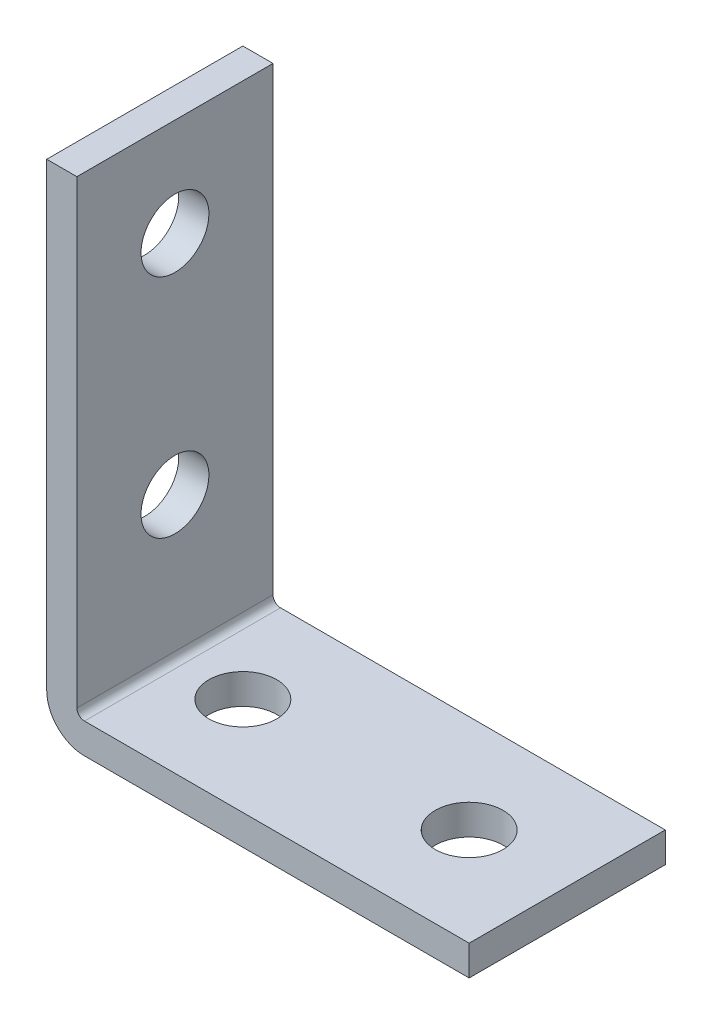
ISO-10303-21;
HEADER;
FILE_DESCRIPTION(('STEP AP214'),'2;1');
FILE_NAME('part.step','',(''),(''),'','','');
FILE_SCHEMA(('AUTOMOTIVE_DESIGN { 1 0 10303 214 1 1 1 1 }'));
ENDSEC;
DATA;
#1=APPLICATION_CONTEXT('core data for automotive mechanical design processes');
#2=APPLICATION_PROTOCOL_DEFINITION('international standard','automotive_design',2000,#1);
#3=PRODUCT_CONTEXT('',#1,'mechanical');
#4=PRODUCT('Part','Part','',(#3));
#5=PRODUCT_RELATED_PRODUCT_CATEGORY('part','',(#4));
#6=PRODUCT_DEFINITION_FORMATION('','',#4);
#7=PRODUCT_DEFINITION_CONTEXT('part definition',#1,'design');
#8=PRODUCT_DEFINITION('design','',#6,#7);
#9=PRODUCT_DEFINITION_SHAPE('','',#8);
#10=(LENGTH_UNIT() NAMED_UNIT(*) SI_UNIT(.MILLI.,.METRE.));
#11=(NAMED_UNIT(*) PLANE_ANGLE_UNIT() SI_UNIT($,.RADIAN.));
#12=(NAMED_UNIT(*) SI_UNIT($,.STERADIAN.) SOLID_ANGLE_UNIT());
#13=UNCERTAINTY_MEASURE_WITH_UNIT(LENGTH_MEASURE(1.E-05),#10,'distance_accuracy_value','');
#14=(GEOMETRIC_REPRESENTATION_CONTEXT(3) GLOBAL_UNCERTAINTY_ASSIGNED_CONTEXT((#13)) GLOBAL_UNIT_ASSIGNED_CONTEXT((#10,
#11,#12)) REPRESENTATION_CONTEXT('',''));
#15=CARTESIAN_POINT('',(0.,0.,0.));
#16=DIRECTION('',(0.,0.,1.));
#17=DIRECTION('',(1.,0.,0.));
#18=AXIS2_PLACEMENT_3D('',#15,#16,#17);
#19=CARTESIAN_POINT('',(7.93750000000001,0.,20.6375));
#20=DIRECTION('',(0.,1.,0.));
#21=DIRECTION('',(0.,0.,1.));
#22=AXIS2_PLACEMENT_3D('',#19,#20,#21);
#23=PLANE('',#22);
#24=CARTESIAN_POINT('',(20.6375,0.,0.));
#25=DIRECTION('',(0.,1.,0.));
#26=DIRECTION('',(0.,0.,1.));
#27=AXIS2_PLACEMENT_3D('',#24,#25,#26);
#28=CIRCLE('',#27,7.14375);
#29=CARTESIAN_POINT('',(20.6375,0.,7.14375));
#30=VERTEX_POINT('',#29);
#31=EDGE_CURVE('E180',#30,#30,#28,.T.);
#32=ORIENTED_EDGE('',*,*,#31,.T.);
#33=EDGE_LOOP('',(#32));
#34=FACE_BOUND('',#33,.T.);
#35=CARTESIAN_POINT('',(68.2625,0.,0.));
#36=DIRECTION('',(0.,1.,0.));
#37=DIRECTION('',(0.,0.,1.));
#38=AXIS2_PLACEMENT_3D('',#35,#36,#37);
#39=CIRCLE('',#38,7.14375);
#40=CARTESIAN_POINT('',(68.2625,0.,7.14375));
#41=VERTEX_POINT('',#40);
#42=EDGE_CURVE('E133',#41,#41,#39,.T.);
#43=ORIENTED_EDGE('',*,*,#42,.T.);
#44=EDGE_LOOP('',(#43));
#45=FACE_BOUND('',#44,.T.);
#46=DIRECTION('',(1.,0.,0.));
#47=VECTOR('',#46,1.);
#48=CARTESIAN_POINT('',(7.93750000000001,0.,-20.6375));
#49=LINE('',#48,#47);
#50=CARTESIAN_POINT('',(7.93750000000001,0.,-20.6375));
#51=VERTEX_POINT('',#50);
#52=CARTESIAN_POINT('',(88.9,0.,-20.6375));
#53=VERTEX_POINT('',#52);
#54=EDGE_CURVE('E129',#51,#53,#49,.T.);
#55=ORIENTED_EDGE('',*,*,#54,.T.);
#56=DIRECTION('',(0.,0.,-1.));
#57=VECTOR('',#56,1.);
#58=CARTESIAN_POINT('',(88.9,0.,20.6375));
#59=LINE('',#58,#57);
#60=CARTESIAN_POINT('',(88.9,0.,20.6375));
#61=VERTEX_POINT('',#60);
#62=EDGE_CURVE('E11',#61,#53,#59,.T.);
#63=ORIENTED_EDGE('',*,*,#62,.F.);
#64=DIRECTION('',(1.,0.,0.));
#65=VECTOR('',#64,1.);
#66=CARTESIAN_POINT('',(7.93750000000001,0.,20.6375));
#67=LINE('',#66,#65);
#68=CARTESIAN_POINT('',(7.93750000000001,0.,20.6375));
#69=VERTEX_POINT('',#68);
#70=EDGE_CURVE('E87',#69,#61,#67,.T.);
#71=ORIENTED_EDGE('',*,*,#70,.F.);
#72=DIRECTION('',(0.,0.,-1.));
#73=VECTOR('',#72,1.);
#74=CARTESIAN_POINT('',(7.93750000000001,0.,20.6375));
#75=LINE('',#74,#73);
#76=EDGE_CURVE('E128',#69,#51,#75,.T.);
#77=ORIENTED_EDGE('',*,*,#76,.T.);
#78=EDGE_LOOP('',(#55,#63,#71,#77));
#79=FACE_BOUND('',#78,.T.);
#80=ADVANCED_FACE('F32',(#34,#45,#79),#23,.F.);
#81=CARTESIAN_POINT('',(88.9,6.35,20.6375));
#82=DIRECTION('',(1.,0.,0.));
#83=DIRECTION('',(0.,0.,-1.));
#84=AXIS2_PLACEMENT_3D('',#81,#82,#83);
#85=PLANE('',#84);
#86=DIRECTION('',(0.,-1.,0.));
#87=VECTOR('',#86,1.);
#88=CARTESIAN_POINT('',(88.9,6.35,-20.6375));
#89=LINE('',#88,#87);
#90=CARTESIAN_POINT('',(88.9,6.35,-20.6375));
#91=VERTEX_POINT('',#90);
#92=EDGE_CURVE('E132',#91,#53,#89,.T.);
#93=ORIENTED_EDGE('',*,*,#92,.F.);
#94=DIRECTION('',(0.,0.,-1.));
#95=VECTOR('',#94,1.);
#96=CARTESIAN_POINT('',(88.9,6.35,20.6375));
#97=LINE('',#96,#95);
#98=CARTESIAN_POINT('',(88.9,6.35,20.6375));
#99=VERTEX_POINT('',#98);
#100=EDGE_CURVE('E40',#99,#91,#97,.T.);
#101=ORIENTED_EDGE('',*,*,#100,.F.);
#102=DIRECTION('',(0.,-1.,0.));
#103=VECTOR('',#102,1.);
#104=CARTESIAN_POINT('',(88.9,6.35,20.6375));
#105=LINE('',#104,#103);
#106=EDGE_CURVE('E172',#99,#61,#105,.T.);
#107=ORIENTED_EDGE('',*,*,#106,.T.);
#108=ORIENTED_EDGE('',*,*,#62,.T.);
#109=EDGE_LOOP('',(#93,#101,#107,#108));
#110=FACE_BOUND('',#109,.T.);
#111=ADVANCED_FACE('F163',(#110),#85,.T.);
#112=CARTESIAN_POINT('',(7.93750000000001,6.35,20.6375));
#113=DIRECTION('',(0.,1.,0.));
#114=DIRECTION('',(0.,0.,1.));
#115=AXIS2_PLACEMENT_3D('',#112,#113,#114);
#116=PLANE('',#115);
#117=CARTESIAN_POINT('',(20.6375,6.35,0.));
#118=DIRECTION('',(0.,1.,0.));
#119=DIRECTION('',(0.,0.,1.));
#120=AXIS2_PLACEMENT_3D('',#117,#118,#119);
#121=CIRCLE('',#120,7.14375);
#122=CARTESIAN_POINT('',(20.6375,6.35,7.14375));
#123=VERTEX_POINT('',#122);
#124=EDGE_CURVE('E183',#123,#123,#121,.T.);
#125=ORIENTED_EDGE('',*,*,#124,.F.);
#126=EDGE_LOOP('',(#125));
#127=FACE_BOUND('',#126,.T.);
#128=CARTESIAN_POINT('',(68.2625,6.35,0.));
#129=DIRECTION('',(0.,1.,0.));
#130=DIRECTION('',(0.,0.,1.));
#131=AXIS2_PLACEMENT_3D('',#128,#129,#130);
#132=CIRCLE('',#131,7.14375);
#133=CARTESIAN_POINT('',(68.2625,6.35,7.14375));
#134=VERTEX_POINT('',#133);
#135=EDGE_CURVE('E177',#134,#134,#132,.T.);
#136=ORIENTED_EDGE('',*,*,#135,.F.);
#137=EDGE_LOOP('',(#136));
#138=FACE_BOUND('',#137,.T.);
#139=DIRECTION('',(1.,0.,0.));
#140=VECTOR('',#139,1.);
#141=CARTESIAN_POINT('',(7.93750000000001,6.35,-20.6375));
#142=LINE('',#141,#140);
#143=CARTESIAN_POINT('',(7.93750000000001,6.35,-20.6375));
#144=VERTEX_POINT('',#143);
#145=EDGE_CURVE('E136',#144,#91,#142,.T.);
#146=ORIENTED_EDGE('',*,*,#145,.F.);
#147=DIRECTION('',(0.,0.,-1.));
#148=VECTOR('',#147,1.);
#149=CARTESIAN_POINT('',(7.93750000000001,6.35,20.6375));
#150=LINE('',#149,#148);
#151=CARTESIAN_POINT('',(7.93750000000001,6.35,20.6375));
#152=VERTEX_POINT('',#151);
#153=EDGE_CURVE('E153',#152,#144,#150,.T.);
#154=ORIENTED_EDGE('',*,*,#153,.F.);
#155=DIRECTION('',(1.,0.,0.));
#156=VECTOR('',#155,1.);
#157=CARTESIAN_POINT('',(7.93750000000001,6.35,20.6375));
#158=LINE('',#157,#156);
#159=EDGE_CURVE('E160',#152,#99,#158,.T.);
#160=ORIENTED_EDGE('',*,*,#159,.T.);
#161=ORIENTED_EDGE('',*,*,#100,.T.);
#162=EDGE_LOOP('',(#146,#154,#160,#161));
#163=FACE_BOUND('',#162,.T.);
#164=ADVANCED_FACE('F158',(#127,#138,#163),#116,.T.);
#165=CARTESIAN_POINT('',(7.93750000000001,7.9375,20.6375));
#166=DIRECTION('',(0.,0.,-1.));
#167=DIRECTION('',(-1.,0.,0.));
#168=AXIS2_PLACEMENT_3D('',#165,#166,#167);
#169=CYLINDRICAL_SURFACE('',#168,1.5875);
#170=CARTESIAN_POINT('',(7.93750000000001,7.9375,-20.6375));
#171=DIRECTION('',(0.,0.,1.));
#172=DIRECTION('',(1.,0.,0.));
#173=AXIS2_PLACEMENT_3D('',#170,#171,#172);
#174=CIRCLE('',#173,1.5875);
#175=CARTESIAN_POINT('',(6.35000000000001,7.9375,-20.6375));
#176=VERTEX_POINT('',#175);
#177=EDGE_CURVE('E139',#176,#144,#174,.T.);
#178=ORIENTED_EDGE('',*,*,#177,.F.);
#179=DIRECTION('',(0.,0.,-1.));
#180=VECTOR('',#179,1.);
#181=CARTESIAN_POINT('',(6.35000000000001,7.9375,20.6375));
#182=LINE('',#181,#180);
#183=CARTESIAN_POINT('',(6.35000000000001,7.9375,20.6375));
#184=VERTEX_POINT('',#183);
#185=EDGE_CURVE('E151',#184,#176,#182,.T.);
#186=ORIENTED_EDGE('',*,*,#185,.F.);
#187=CARTESIAN_POINT('',(7.93750000000001,7.9375,20.6375));
#188=DIRECTION('',(0.,0.,1.));
#189=DIRECTION('',(1.,0.,0.));
#190=AXIS2_PLACEMENT_3D('',#187,#188,#189);
#191=CIRCLE('',#190,1.5875);
#192=EDGE_CURVE('E123',#184,#152,#191,.T.);
#193=ORIENTED_EDGE('',*,*,#192,.T.);
#194=ORIENTED_EDGE('',*,*,#153,.T.);
#195=EDGE_LOOP('',(#178,#186,#193,#194));
#196=FACE_BOUND('',#195,.T.);
#197=ADVANCED_FACE('F170',(#196),#169,.F.);
#198=CARTESIAN_POINT('',(6.35,104.775,20.6375));
#199=DIRECTION('',(1.,0.,0.));
#200=DIRECTION('',(0.,1.,0.));
#201=AXIS2_PLACEMENT_3D('',#198,#199,#200);
#202=PLANE('',#201);
#203=CARTESIAN_POINT('',(6.35000000000001,36.5125,0.));
#204=DIRECTION('',(1.,0.,0.));
#205=DIRECTION('',(0.,1.,0.));
#206=AXIS2_PLACEMENT_3D('',#203,#204,#205);
#207=CIRCLE('',#206,7.14375);
#208=CARTESIAN_POINT('',(6.35000000000001,43.65625,0.));
#209=VERTEX_POINT('',#208);
#210=EDGE_CURVE('E195',#209,#209,#207,.T.);
#211=ORIENTED_EDGE('',*,*,#210,.F.);
#212=EDGE_LOOP('',(#211));
#213=FACE_BOUND('',#212,.T.);
#214=CARTESIAN_POINT('',(6.35,84.1375,0.));
#215=DIRECTION('',(1.,0.,0.));
#216=DIRECTION('',(0.,1.,0.));
#217=AXIS2_PLACEMENT_3D('',#214,#215,#216);
#218=CIRCLE('',#217,7.14375);
#219=CARTESIAN_POINT('',(6.35,91.28125,0.));
#220=VERTEX_POINT('',#219);
#221=EDGE_CURVE('E189',#220,#220,#218,.T.);
#222=ORIENTED_EDGE('',*,*,#221,.F.);
#223=EDGE_LOOP('',(#222));
#224=FACE_BOUND('',#223,.T.);
#225=DIRECTION('',(0.,-1.,0.));
#226=VECTOR('',#225,1.);
#227=CARTESIAN_POINT('',(6.35,104.775,-20.6375));
#228=LINE('',#227,#226);
#229=CARTESIAN_POINT('',(6.35,104.775,-20.6375));
#230=VERTEX_POINT('',#229);
#231=EDGE_CURVE('E142',#230,#176,#228,.T.);
#232=ORIENTED_EDGE('',*,*,#231,.F.);
#233=DIRECTION('',(0.,0.,-1.));
#234=VECTOR('',#233,1.);
#235=CARTESIAN_POINT('',(6.35,104.775,20.6375));
#236=LINE('',#235,#234);
#237=CARTESIAN_POINT('',(6.35,104.775,20.6375));
#238=VERTEX_POINT('',#237);
#239=EDGE_CURVE('E111',#238,#230,#236,.T.);
#240=ORIENTED_EDGE('',*,*,#239,.F.);
#241=DIRECTION('',(0.,-1.,0.));
#242=VECTOR('',#241,1.);
#243=CARTESIAN_POINT('',(6.35,104.775,20.6375));
#244=LINE('',#243,#242);
#245=EDGE_CURVE('E121',#238,#184,#244,.T.);
#246=ORIENTED_EDGE('',*,*,#245,.T.);
#247=ORIENTED_EDGE('',*,*,#185,.T.);
#248=EDGE_LOOP('',(#232,#240,#246,#247));
#249=FACE_BOUND('',#248,.T.);
#250=ADVANCED_FACE('F210',(#213,#224,#249),#202,.T.);
#251=CARTESIAN_POINT('',(0.,104.775,20.6375));
#252=DIRECTION('',(0.,1.,0.));
#253=DIRECTION('',(0.,0.,1.));
#254=AXIS2_PLACEMENT_3D('',#251,#252,#253);
#255=PLANE('',#254);
#256=DIRECTION('',(1.,0.,0.));
#257=VECTOR('',#256,1.);
#258=CARTESIAN_POINT('',(0.,104.775,-20.6375));
#259=LINE('',#258,#257);
#260=CARTESIAN_POINT('',(0.,104.775,-20.6375));
#261=VERTEX_POINT('',#260);
#262=EDGE_CURVE('E110',#261,#230,#259,.T.);
#263=ORIENTED_EDGE('',*,*,#262,.F.);
#264=DIRECTION('',(0.,0.,-1.));
#265=VECTOR('',#264,1.);
#266=CARTESIAN_POINT('',(0.,104.775,20.6375));
#267=LINE('',#266,#265);
#268=CARTESIAN_POINT('',(0.,104.775,20.6375));
#269=VERTEX_POINT('',#268);
#270=EDGE_CURVE('E104',#269,#261,#267,.T.);
#271=ORIENTED_EDGE('',*,*,#270,.F.);
#272=DIRECTION('',(1.,0.,0.));
#273=VECTOR('',#272,1.);
#274=CARTESIAN_POINT('',(0.,104.775,20.6375));
#275=LINE('',#274,#273);
#276=EDGE_CURVE('E108',#269,#238,#275,.T.);
#277=ORIENTED_EDGE('',*,*,#276,.T.);
#278=ORIENTED_EDGE('',*,*,#239,.T.);
#279=EDGE_LOOP('',(#263,#271,#277,#278));
#280=FACE_BOUND('',#279,.T.);
#281=ADVANCED_FACE('F106',(#280),#255,.T.);
#282=CARTESIAN_POINT('',(0.,104.775,20.6375));
#283=DIRECTION('',(1.,0.,0.));
#284=DIRECTION('',(0.,1.,0.));
#285=AXIS2_PLACEMENT_3D('',#282,#283,#284);
#286=PLANE('',#285);
#287=CARTESIAN_POINT('',(0.,36.5125,0.));
#288=DIRECTION('',(1.,0.,0.));
#289=DIRECTION('',(0.,1.,0.));
#290=AXIS2_PLACEMENT_3D('',#287,#288,#289);
#291=CIRCLE('',#290,7.14375);
#292=CARTESIAN_POINT('',(0.,43.65625,0.));
#293=VERTEX_POINT('',#292);
#294=EDGE_CURVE('E192',#293,#293,#291,.T.);
#295=ORIENTED_EDGE('',*,*,#294,.T.);
#296=EDGE_LOOP('',(#295));
#297=FACE_BOUND('',#296,.T.);
#298=CARTESIAN_POINT('',(0.,84.1375,0.));
#299=DIRECTION('',(1.,0.,0.));
#300=DIRECTION('',(0.,1.,0.));
#301=AXIS2_PLACEMENT_3D('',#298,#299,#300);
#302=CIRCLE('',#301,7.14375);
#303=CARTESIAN_POINT('',(0.,91.28125,0.));
#304=VERTEX_POINT('',#303);
#305=EDGE_CURVE('E186',#304,#304,#302,.T.);
#306=ORIENTED_EDGE('',*,*,#305,.T.);
#307=EDGE_LOOP('',(#306));
#308=FACE_BOUND('',#307,.T.);
#309=DIRECTION('',(0.,-1.,0.));
#310=VECTOR('',#309,1.);
#311=CARTESIAN_POINT('',(0.,104.775,-20.6375));
#312=LINE('',#311,#310);
#313=CARTESIAN_POINT('',(0.,7.9375,-20.6375));
#314=VERTEX_POINT('',#313);
#315=EDGE_CURVE('E75',#261,#314,#312,.T.);
#316=ORIENTED_EDGE('',*,*,#315,.T.);
#317=DIRECTION('',(0.,0.,-1.));
#318=VECTOR('',#317,1.);
#319=CARTESIAN_POINT('',(0.,7.9375,20.6375));
#320=LINE('',#319,#318);
#321=CARTESIAN_POINT('',(0.,7.9375,20.6375));
#322=VERTEX_POINT('',#321);
#323=EDGE_CURVE('E112',#322,#314,#320,.T.);
#324=ORIENTED_EDGE('',*,*,#323,.F.);
#325=DIRECTION('',(0.,-1.,0.));
#326=VECTOR('',#325,1.);
#327=CARTESIAN_POINT('',(0.,104.775,20.6375));
#328=LINE('',#327,#326);
#329=EDGE_CURVE('E114',#269,#322,#328,.T.);
#330=ORIENTED_EDGE('',*,*,#329,.F.);
#331=ORIENTED_EDGE('',*,*,#270,.T.);
#332=EDGE_LOOP('',(#316,#324,#330,#331));
#333=FACE_BOUND('',#332,.T.);
#334=ADVANCED_FACE('F115',(#297,#308,#333),#286,.F.);
#335=CARTESIAN_POINT('',(7.93750000000001,7.9375,20.6375));
#336=DIRECTION('',(0.,0.,-1.));
#337=DIRECTION('',(-1.,0.,0.));
#338=AXIS2_PLACEMENT_3D('',#335,#336,#337);
#339=CYLINDRICAL_SURFACE('',#338,7.9375);
#340=CARTESIAN_POINT('',(7.93750000000001,7.9375,-20.6375));
#341=DIRECTION('',(0.,0.,1.));
#342=DIRECTION('',(1.,0.,0.));
#343=AXIS2_PLACEMENT_3D('',#340,#341,#342);
#344=CIRCLE('',#343,7.9375);
#345=EDGE_CURVE('E81',#314,#51,#344,.T.);
#346=ORIENTED_EDGE('',*,*,#345,.T.);
#347=ORIENTED_EDGE('',*,*,#76,.F.);
#348=CARTESIAN_POINT('',(7.93750000000001,7.9375,20.6375));
#349=DIRECTION('',(0.,0.,1.));
#350=DIRECTION('',(1.,0.,0.));
#351=AXIS2_PLACEMENT_3D('',#348,#349,#350);
#352=CIRCLE('',#351,7.9375);
#353=EDGE_CURVE('E48',#322,#69,#352,.T.);
#354=ORIENTED_EDGE('',*,*,#353,.F.);
#355=ORIENTED_EDGE('',*,*,#323,.T.);
#356=EDGE_LOOP('',(#346,#347,#354,#355));
#357=FACE_BOUND('',#356,.T.);
#358=ADVANCED_FACE('F217',(#357),#339,.T.);
#359=CARTESIAN_POINT('',(7.93750000000001,7.9375,20.6375));
#360=DIRECTION('',(0.,0.,1.));
#361=DIRECTION('',(1.,0.,0.));
#362=AXIS2_PLACEMENT_3D('',#359,#360,#361);
#363=PLANE('',#362);
#364=ORIENTED_EDGE('',*,*,#70,.T.);
#365=ORIENTED_EDGE('',*,*,#106,.F.);
#366=ORIENTED_EDGE('',*,*,#159,.F.);
#367=ORIENTED_EDGE('',*,*,#192,.F.);
#368=ORIENTED_EDGE('',*,*,#245,.F.);
#369=ORIENTED_EDGE('',*,*,#276,.F.);
#370=ORIENTED_EDGE('',*,*,#329,.T.);
#371=ORIENTED_EDGE('',*,*,#353,.T.);
#372=EDGE_LOOP('',(#364,#365,#366,#367,#368,#369,#370,#371));
#373=FACE_BOUND('',#372,.T.);
#374=ADVANCED_FACE('F118',(#373),#363,.T.);
#375=CARTESIAN_POINT('',(7.93750000000001,7.9375,-20.6375));
#376=DIRECTION('',(0.,0.,1.));
#377=DIRECTION('',(1.,0.,0.));
#378=AXIS2_PLACEMENT_3D('',#375,#376,#377);
#379=PLANE('',#378);
#380=ORIENTED_EDGE('',*,*,#54,.F.);
#381=ORIENTED_EDGE('',*,*,#345,.F.);
#382=ORIENTED_EDGE('',*,*,#315,.F.);
#383=ORIENTED_EDGE('',*,*,#262,.T.);
#384=ORIENTED_EDGE('',*,*,#231,.T.);
#385=ORIENTED_EDGE('',*,*,#177,.T.);
#386=ORIENTED_EDGE('',*,*,#145,.T.);
#387=ORIENTED_EDGE('',*,*,#92,.T.);
#388=EDGE_LOOP('',(#380,#381,#382,#383,#384,#385,#386,#387));
#389=FACE_BOUND('',#388,.T.);
#390=ADVANCED_FACE('F166',(#389),#379,.F.);
#391=CARTESIAN_POINT('',(68.2625,0.,0.));
#392=DIRECTION('',(0.,1.,0.));
#393=DIRECTION('',(0.,0.,1.));
#394=AXIS2_PLACEMENT_3D('',#391,#392,#393);
#395=CYLINDRICAL_SURFACE('',#394,7.14375);
#396=ORIENTED_EDGE('',*,*,#42,.F.);
#397=EDGE_LOOP('',(#396));
#398=FACE_BOUND('',#397,.T.);
#399=ORIENTED_EDGE('',*,*,#135,.T.);
#400=EDGE_LOOP('',(#399));
#401=FACE_BOUND('',#400,.T.);
#402=ADVANCED_FACE('F236',(#398,#401),#395,.F.);
#403=CARTESIAN_POINT('',(20.6375,0.,0.));
#404=DIRECTION('',(0.,1.,0.));
#405=DIRECTION('',(0.,0.,1.));
#406=AXIS2_PLACEMENT_3D('',#403,#404,#405);
#407=CYLINDRICAL_SURFACE('',#406,7.14375);
#408=ORIENTED_EDGE('',*,*,#31,.F.);
#409=EDGE_LOOP('',(#408));
#410=FACE_BOUND('',#409,.T.);
#411=ORIENTED_EDGE('',*,*,#124,.T.);
#412=EDGE_LOOP('',(#411));
#413=FACE_BOUND('',#412,.T.);
#414=ADVANCED_FACE('F239',(#410,#413),#407,.F.);
#415=CARTESIAN_POINT('',(0.,84.1375,0.));
#416=DIRECTION('',(1.,0.,0.));
#417=DIRECTION('',(0.,1.,0.));
#418=AXIS2_PLACEMENT_3D('',#415,#416,#417);
#419=CYLINDRICAL_SURFACE('',#418,7.14375);
#420=ORIENTED_EDGE('',*,*,#305,.F.);
#421=EDGE_LOOP('',(#420));
#422=FACE_BOUND('',#421,.T.);
#423=ORIENTED_EDGE('',*,*,#221,.T.);
#424=EDGE_LOOP('',(#423));
#425=FACE_BOUND('',#424,.T.);
#426=ADVANCED_FACE('F206',(#422,#425),#419,.F.);
#427=CARTESIAN_POINT('',(0.,36.5125,0.));
#428=DIRECTION('',(1.,0.,0.));
#429=DIRECTION('',(0.,1.,0.));
#430=AXIS2_PLACEMENT_3D('',#427,#428,#429);
#431=CYLINDRICAL_SURFACE('',#430,7.14375);
#432=ORIENTED_EDGE('',*,*,#294,.F.);
#433=EDGE_LOOP('',(#432));
#434=FACE_BOUND('',#433,.T.);
#435=ORIENTED_EDGE('',*,*,#210,.T.);
#436=EDGE_LOOP('',(#435));
#437=FACE_BOUND('',#436,.T.);
#438=ADVANCED_FACE('F203',(#434,#437),#431,.F.);
#439=CLOSED_SHELL('',(#80,#111,#164,#197,#250,#281,#334,#358,#374,#390,#402,#414,#426,#438));
#440=MANIFOLD_SOLID_BREP('B2',#439);
#441=ADVANCED_BREP_SHAPE_REPRESENTATION('',(#18,#440),#14);
#442=SHAPE_DEFINITION_REPRESENTATION(#9,#441);
ENDSEC;
END-ISO-10303-21;
